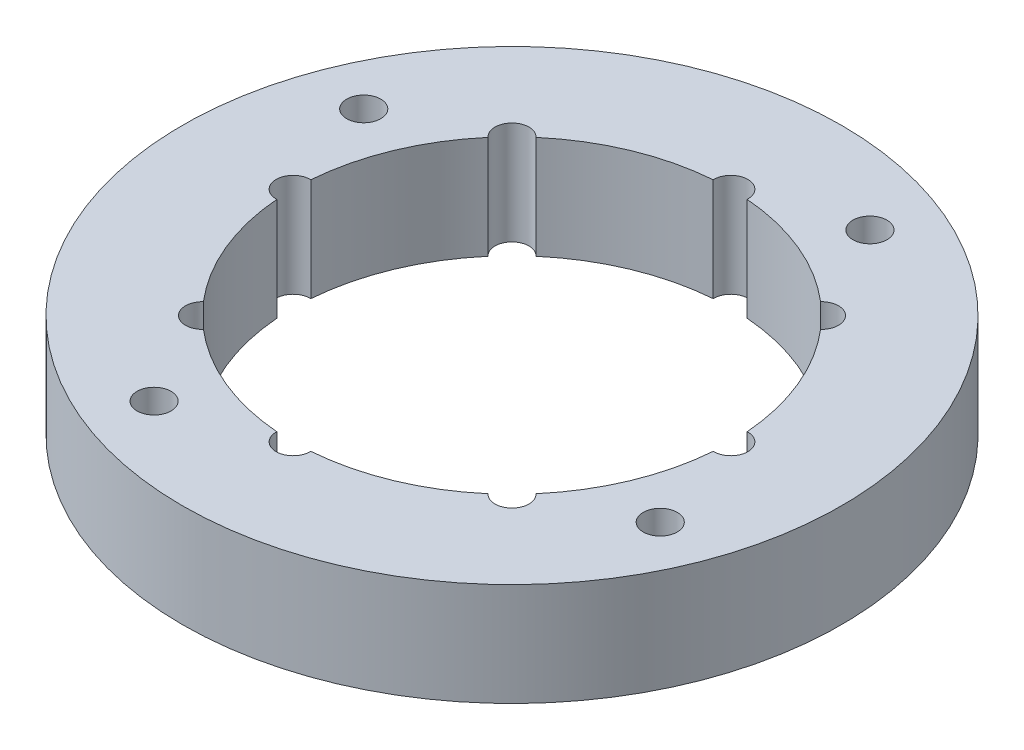
ISO-10303-21;
HEADER;
FILE_DESCRIPTION(('STEP AP214'),'2;1');
FILE_NAME('part.step','',(''),(''),'','','');
FILE_SCHEMA(('AUTOMOTIVE_DESIGN { 1 0 10303 214 1 1 1 1 }'));
ENDSEC;
DATA;
#1=APPLICATION_CONTEXT('core data for automotive mechanical design processes');
#2=APPLICATION_PROTOCOL_DEFINITION('international standard','automotive_design',2000,#1);
#3=PRODUCT_CONTEXT('',#1,'mechanical');
#4=PRODUCT('Part','Part','',(#3));
#5=PRODUCT_RELATED_PRODUCT_CATEGORY('part','',(#4));
#6=PRODUCT_DEFINITION_FORMATION('','',#4);
#7=PRODUCT_DEFINITION_CONTEXT('part definition',#1,'design');
#8=PRODUCT_DEFINITION('design','',#6,#7);
#9=PRODUCT_DEFINITION_SHAPE('','',#8);
#10=(LENGTH_UNIT() NAMED_UNIT(*) SI_UNIT(.MILLI.,.METRE.));
#11=(NAMED_UNIT(*) PLANE_ANGLE_UNIT() SI_UNIT($,.RADIAN.));
#12=(NAMED_UNIT(*) SI_UNIT($,.STERADIAN.) SOLID_ANGLE_UNIT());
#13=UNCERTAINTY_MEASURE_WITH_UNIT(LENGTH_MEASURE(1.E-05),#10,'distance_accuracy_value','');
#14=(GEOMETRIC_REPRESENTATION_CONTEXT(3) GLOBAL_UNCERTAINTY_ASSIGNED_CONTEXT((#13)) GLOBAL_UNIT_ASSIGNED_CONTEXT((#10,
#11,#12)) REPRESENTATION_CONTEXT('',''));
#15=CARTESIAN_POINT('',(0.,0.,0.));
#16=DIRECTION('',(0.,0.,1.));
#17=DIRECTION('',(1.,0.,0.));
#18=AXIS2_PLACEMENT_3D('',#15,#16,#17);
#19=CARTESIAN_POINT('',(-19.0830442572718,12.7,-19.0830442572718));
#20=DIRECTION('',(0.,-1.,0.));
#21=DIRECTION('',(0.,0.,-1.));
#22=AXIS2_PLACEMENT_3D('',#19,#20,#21);
#23=CYLINDRICAL_SURFACE('',#22,2.09550000000003);
#24=CARTESIAN_POINT('',(-19.0830442572718,0.,-19.0830442572718));
#25=DIRECTION('',(0.,1.,0.));
#26=DIRECTION('',(0.,0.,1.));
#27=AXIS2_PLACEMENT_3D('',#24,#25,#26);
#28=CIRCLE('',#27,2.09550000000003);
#29=CARTESIAN_POINT('',(-20.5061429417451,0.,-17.5448926443771));
#30=VERTEX_POINT('',#29);
#31=CARTESIAN_POINT('',(-17.5448926443771,0.,-20.5061429417451));
#32=VERTEX_POINT('',#31);
#33=EDGE_CURVE('E203',#30,#32,#28,.F.);
#34=ORIENTED_EDGE('',*,*,#33,.T.);
#35=DIRECTION('',(0.,-1.,0.));
#36=VECTOR('',#35,1.);
#37=CARTESIAN_POINT('',(-17.5448926443771,12.7,-20.5061429417451));
#38=LINE('',#37,#36);
#39=CARTESIAN_POINT('',(-17.5448926443771,12.7,-20.5061429417451));
#40=VERTEX_POINT('',#39);
#41=EDGE_CURVE('E11',#40,#32,#38,.T.);
#42=ORIENTED_EDGE('',*,*,#41,.F.);
#43=CARTESIAN_POINT('',(-19.0830442572718,12.7,-19.0830442572718));
#44=DIRECTION('',(0.,1.,0.));
#45=DIRECTION('',(0.,0.,1.));
#46=AXIS2_PLACEMENT_3D('',#43,#44,#45);
#47=CIRCLE('',#46,2.09550000000003);
#48=CARTESIAN_POINT('',(-20.5061429417451,12.7,-17.5448926443771));
#49=VERTEX_POINT('',#48);
#50=EDGE_CURVE('E318',#49,#40,#47,.F.);
#51=ORIENTED_EDGE('',*,*,#50,.F.);
#52=DIRECTION('',(0.,-1.,0.));
#53=VECTOR('',#52,1.);
#54=CARTESIAN_POINT('',(-20.5061429417451,12.7,-17.5448926443771));
#55=LINE('',#54,#53);
#56=EDGE_CURVE('E185',#49,#30,#55,.T.);
#57=ORIENTED_EDGE('',*,*,#56,.T.);
#58=EDGE_LOOP('',(#34,#42,#51,#57));
#59=FACE_BOUND('',#58,.T.);
#60=ADVANCED_FACE('F41',(#59),#23,.F.);
#61=CARTESIAN_POINT('',(0.,12.7,0.));
#62=DIRECTION('',(0.,-1.,0.));
#63=DIRECTION('',(0.,0.,-1.));
#64=AXIS2_PLACEMENT_3D('',#61,#62,#63);
#65=CYLINDRICAL_SURFACE('',#64,26.9875);
#66=CARTESIAN_POINT('',(0.,0.,0.));
#67=DIRECTION('',(0.,1.,0.));
#68=DIRECTION('',(0.,0.,1.));
#69=AXIS2_PLACEMENT_3D('',#66,#67,#68);
#70=CIRCLE('',#69,26.9875);
#71=CARTESIAN_POINT('',(-2.09392016605936,0.,-26.9061452941177));
#72=VERTEX_POINT('',#71);
#73=EDGE_CURVE('E204',#32,#72,#70,.F.);
#74=ORIENTED_EDGE('',*,*,#73,.T.);
#75=DIRECTION('',(0.,-1.,0.));
#76=VECTOR('',#75,1.);
#77=CARTESIAN_POINT('',(-2.09392016605936,12.7,-26.9061452941177));
#78=LINE('',#77,#76);
#79=CARTESIAN_POINT('',(-2.09392016605936,12.7,-26.9061452941177));
#80=VERTEX_POINT('',#79);
#81=EDGE_CURVE('E49',#80,#72,#78,.T.);
#82=ORIENTED_EDGE('',*,*,#81,.F.);
#83=CARTESIAN_POINT('',(0.,12.7,0.));
#84=DIRECTION('',(0.,1.,0.));
#85=DIRECTION('',(0.,0.,1.));
#86=AXIS2_PLACEMENT_3D('',#83,#84,#85);
#87=CIRCLE('',#86,26.9875);
#88=EDGE_CURVE('E121',#40,#80,#87,.F.);
#89=ORIENTED_EDGE('',*,*,#88,.F.);
#90=ORIENTED_EDGE('',*,*,#41,.T.);
#91=EDGE_LOOP('',(#74,#82,#89,#90));
#92=FACE_BOUND('',#91,.T.);
#93=ADVANCED_FACE('F334',(#92),#65,.F.);
#94=CARTESIAN_POINT('',(1.11022302462516E-13,12.7,-26.9874999999999));
#95=DIRECTION('',(0.,-1.,0.));
#96=DIRECTION('',(0.,0.,-1.));
#97=AXIS2_PLACEMENT_3D('',#94,#95,#96);
#98=CYLINDRICAL_SURFACE('',#97,2.09549999999993);
#99=CARTESIAN_POINT('',(1.11022302462516E-13,0.,-26.9874999999999));
#100=DIRECTION('',(0.,1.,0.));
#101=DIRECTION('',(0.,0.,1.));
#102=AXIS2_PLACEMENT_3D('',#99,#100,#101);
#103=CIRCLE('',#102,2.09549999999993);
#104=CARTESIAN_POINT('',(2.09392016605958,0.,-26.9061452941177));
#105=VERTEX_POINT('',#104);
#106=EDGE_CURVE('E206',#72,#105,#103,.F.);
#107=ORIENTED_EDGE('',*,*,#106,.T.);
#108=DIRECTION('',(0.,-1.,0.));
#109=VECTOR('',#108,1.);
#110=CARTESIAN_POINT('',(2.09392016605958,12.7,-26.9061452941177));
#111=LINE('',#110,#109);
#112=CARTESIAN_POINT('',(2.09392016605958,12.7,-26.9061452941177));
#113=VERTEX_POINT('',#112);
#114=EDGE_CURVE('E265',#113,#105,#111,.T.);
#115=ORIENTED_EDGE('',*,*,#114,.F.);
#116=CARTESIAN_POINT('',(1.11022302462516E-13,12.7,-26.9874999999999));
#117=DIRECTION('',(0.,1.,0.));
#118=DIRECTION('',(0.,0.,1.));
#119=AXIS2_PLACEMENT_3D('',#116,#117,#118);
#120=CIRCLE('',#119,2.09549999999993);
#121=EDGE_CURVE('E269',#80,#113,#120,.F.);
#122=ORIENTED_EDGE('',*,*,#121,.F.);
#123=ORIENTED_EDGE('',*,*,#81,.T.);
#124=EDGE_LOOP('',(#107,#115,#122,#123));
#125=FACE_BOUND('',#124,.T.);
#126=ADVANCED_FACE('F268',(#125),#98,.F.);
#127=CARTESIAN_POINT('',(0.,12.7,0.));
#128=DIRECTION('',(0.,-1.,0.));
#129=DIRECTION('',(0.,0.,-1.));
#130=AXIS2_PLACEMENT_3D('',#127,#128,#129);
#131=CYLINDRICAL_SURFACE('',#130,26.9875);
#132=CARTESIAN_POINT('',(0.,0.,0.));
#133=DIRECTION('',(0.,1.,0.));
#134=DIRECTION('',(0.,0.,1.));
#135=AXIS2_PLACEMENT_3D('',#132,#133,#134);
#136=CIRCLE('',#135,26.9875);
#137=CARTESIAN_POINT('',(17.5448926443797,0.,-20.5061429417429));
#138=VERTEX_POINT('',#137);
#139=EDGE_CURVE('E208',#105,#138,#136,.F.);
#140=ORIENTED_EDGE('',*,*,#139,.T.);
#141=DIRECTION('',(0.,-1.,0.));
#142=VECTOR('',#141,1.);
#143=CARTESIAN_POINT('',(17.5448926443797,12.7,-20.5061429417429));
#144=LINE('',#143,#142);
#145=CARTESIAN_POINT('',(17.5448926443797,12.7,-20.5061429417429));
#146=VERTEX_POINT('',#145);
#147=EDGE_CURVE('E259',#146,#138,#144,.T.);
#148=ORIENTED_EDGE('',*,*,#147,.F.);
#149=CARTESIAN_POINT('',(0.,12.7,0.));
#150=DIRECTION('',(0.,1.,0.));
#151=DIRECTION('',(0.,0.,1.));
#152=AXIS2_PLACEMENT_3D('',#149,#150,#151);
#153=CIRCLE('',#152,26.9875);
#154=EDGE_CURVE('E288',#113,#146,#153,.F.);
#155=ORIENTED_EDGE('',*,*,#154,.F.);
#156=ORIENTED_EDGE('',*,*,#114,.T.);
#157=EDGE_LOOP('',(#140,#148,#155,#156));
#158=FACE_BOUND('',#157,.T.);
#159=ADVANCED_FACE('F276',(#158),#131,.F.);
#160=CARTESIAN_POINT('',(19.0830442572715,12.7,-19.0830442572726));
#161=DIRECTION('',(0.,-1.,0.));
#162=DIRECTION('',(0.,0.,-1.));
#163=AXIS2_PLACEMENT_3D('',#160,#161,#162);
#164=CYLINDRICAL_SURFACE('',#163,2.09549999999588);
#165=CARTESIAN_POINT('',(19.0830442572715,0.,-19.0830442572726));
#166=DIRECTION('',(0.,1.,0.));
#167=DIRECTION('',(0.,0.,1.));
#168=AXIS2_PLACEMENT_3D('',#165,#166,#167);
#169=CIRCLE('',#168,2.09549999999588);
#170=CARTESIAN_POINT('',(20.5061429417419,0.,-17.5448926443808));
#171=VERTEX_POINT('',#170);
#172=EDGE_CURVE('E209',#138,#171,#169,.F.);
#173=ORIENTED_EDGE('',*,*,#172,.T.);
#174=DIRECTION('',(0.,-1.,0.));
#175=VECTOR('',#174,1.);
#176=CARTESIAN_POINT('',(20.5061429417419,12.7,-17.5448926443808));
#177=LINE('',#176,#175);
#178=CARTESIAN_POINT('',(20.5061429417419,12.7,-17.5448926443808));
#179=VERTEX_POINT('',#178);
#180=EDGE_CURVE('E258',#179,#171,#177,.T.);
#181=ORIENTED_EDGE('',*,*,#180,.F.);
#182=CARTESIAN_POINT('',(19.0830442572715,12.7,-19.0830442572726));
#183=DIRECTION('',(0.,1.,0.));
#184=DIRECTION('',(0.,0.,1.));
#185=AXIS2_PLACEMENT_3D('',#182,#183,#184);
#186=CIRCLE('',#185,2.09549999999588);
#187=EDGE_CURVE('E282',#146,#179,#186,.F.);
#188=ORIENTED_EDGE('',*,*,#187,.F.);
#189=ORIENTED_EDGE('',*,*,#147,.T.);
#190=EDGE_LOOP('',(#173,#181,#188,#189));
#191=FACE_BOUND('',#190,.T.);
#192=ADVANCED_FACE('F285',(#191),#164,.F.);
#193=CARTESIAN_POINT('',(0.,12.7,0.));
#194=DIRECTION('',(0.,-1.,0.));
#195=DIRECTION('',(0.,0.,-1.));
#196=AXIS2_PLACEMENT_3D('',#193,#194,#195);
#197=CYLINDRICAL_SURFACE('',#196,26.9875);
#198=CARTESIAN_POINT('',(0.,0.,0.));
#199=DIRECTION('',(0.,1.,0.));
#200=DIRECTION('',(0.,0.,1.));
#201=AXIS2_PLACEMENT_3D('',#198,#199,#200);
#202=CIRCLE('',#201,26.9875);
#203=CARTESIAN_POINT('',(26.9061452941176,0.,-2.09392016605953));
#204=VERTEX_POINT('',#203);
#205=EDGE_CURVE('E215',#171,#204,#202,.F.);
#206=ORIENTED_EDGE('',*,*,#205,.T.);
#207=DIRECTION('',(0.,-1.,0.));
#208=VECTOR('',#207,1.);
#209=CARTESIAN_POINT('',(26.9061452941176,12.7,-2.09392016605953));
#210=LINE('',#209,#208);
#211=CARTESIAN_POINT('',(26.9061452941176,12.7,-2.09392016605953));
#212=VERTEX_POINT('',#211);
#213=EDGE_CURVE('E251',#212,#204,#210,.T.);
#214=ORIENTED_EDGE('',*,*,#213,.F.);
#215=CARTESIAN_POINT('',(0.,12.7,0.));
#216=DIRECTION('',(0.,1.,0.));
#217=DIRECTION('',(0.,0.,1.));
#218=AXIS2_PLACEMENT_3D('',#215,#216,#217);
#219=CIRCLE('',#218,26.9875);
#220=EDGE_CURVE('E290',#179,#212,#219,.F.);
#221=ORIENTED_EDGE('',*,*,#220,.F.);
#222=ORIENTED_EDGE('',*,*,#180,.T.);
#223=EDGE_LOOP('',(#206,#214,#221,#222));
#224=FACE_BOUND('',#223,.T.);
#225=ADVANCED_FACE('F495',(#224),#197,.F.);
#226=CARTESIAN_POINT('',(26.9875000000012,12.7,-4.30211422042248E-13));
#227=DIRECTION('',(0.,-1.,0.));
#228=DIRECTION('',(0.,0.,-1.));
#229=AXIS2_PLACEMENT_3D('',#226,#227,#228);
#230=CYLINDRICAL_SURFACE('',#229,2.09549999999961);
#231=CARTESIAN_POINT('',(26.9875000000012,0.,-4.30211422042248E-13));
#232=DIRECTION('',(0.,1.,0.));
#233=DIRECTION('',(0.,0.,1.));
#234=AXIS2_PLACEMENT_3D('',#231,#232,#233);
#235=CIRCLE('',#234,2.09549999999961);
#236=CARTESIAN_POINT('',(26.9061452941177,0.,2.09392016605867));
#237=VERTEX_POINT('',#236);
#238=EDGE_CURVE('E212',#204,#237,#235,.F.);
#239=ORIENTED_EDGE('',*,*,#238,.T.);
#240=DIRECTION('',(0.,-1.,0.));
#241=VECTOR('',#240,1.);
#242=CARTESIAN_POINT('',(26.9061452941177,12.7,2.09392016605867));
#243=LINE('',#242,#241);
#244=CARTESIAN_POINT('',(26.9061452941177,12.7,2.09392016605867));
#245=VERTEX_POINT('',#244);
#246=EDGE_CURVE('E246',#245,#237,#243,.T.);
#247=ORIENTED_EDGE('',*,*,#246,.F.);
#248=CARTESIAN_POINT('',(26.9875000000012,12.7,-4.30211422042248E-13));
#249=DIRECTION('',(0.,1.,0.));
#250=DIRECTION('',(0.,0.,1.));
#251=AXIS2_PLACEMENT_3D('',#248,#249,#250);
#252=CIRCLE('',#251,2.09549999999961);
#253=EDGE_CURVE('E286',#212,#245,#252,.F.);
#254=ORIENTED_EDGE('',*,*,#253,.F.);
#255=ORIENTED_EDGE('',*,*,#213,.T.);
#256=EDGE_LOOP('',(#239,#247,#254,#255));
#257=FACE_BOUND('',#256,.T.);
#258=ADVANCED_FACE('F483',(#257),#230,.F.);
#259=CARTESIAN_POINT('',(0.,12.7,0.));
#260=DIRECTION('',(0.,-1.,0.));
#261=DIRECTION('',(0.,0.,-1.));
#262=AXIS2_PLACEMENT_3D('',#259,#260,#261);
#263=CYLINDRICAL_SURFACE('',#262,26.9875);
#264=CARTESIAN_POINT('',(0.,0.,0.));
#265=DIRECTION('',(0.,1.,0.));
#266=DIRECTION('',(0.,0.,1.));
#267=AXIS2_PLACEMENT_3D('',#264,#265,#266);
#268=CIRCLE('',#267,26.9875);
#269=CARTESIAN_POINT('',(20.5061429417444,0.,17.5448926443779));
#270=VERTEX_POINT('',#269);
#271=EDGE_CURVE('E216',#237,#270,#268,.F.);
#272=ORIENTED_EDGE('',*,*,#271,.T.);
#273=DIRECTION('',(0.,-1.,0.));
#274=VECTOR('',#273,1.);
#275=CARTESIAN_POINT('',(20.5061429417444,12.7,17.5448926443779));
#276=LINE('',#275,#274);
#277=CARTESIAN_POINT('',(20.5061429417444,12.7,17.5448926443779));
#278=VERTEX_POINT('',#277);
#279=EDGE_CURVE('E250',#278,#270,#276,.T.);
#280=ORIENTED_EDGE('',*,*,#279,.F.);
#281=CARTESIAN_POINT('',(0.,12.7,0.));
#282=DIRECTION('',(0.,1.,0.));
#283=DIRECTION('',(0.,0.,1.));
#284=AXIS2_PLACEMENT_3D('',#281,#282,#283);
#285=CIRCLE('',#284,26.9875);
#286=EDGE_CURVE('E299',#245,#278,#285,.F.);
#287=ORIENTED_EDGE('',*,*,#286,.F.);
#288=ORIENTED_EDGE('',*,*,#246,.T.);
#289=EDGE_LOOP('',(#272,#280,#287,#288));
#290=FACE_BOUND('',#289,.T.);
#291=ADVANCED_FACE('F475',(#290),#263,.F.);
#292=CARTESIAN_POINT('',(19.0830442572704,12.7,19.0830442572693));
#293=DIRECTION('',(0.,-1.,0.));
#294=DIRECTION('',(0.,0.,-1.));
#295=AXIS2_PLACEMENT_3D('',#292,#293,#294);
#296=CYLINDRICAL_SURFACE('',#295,2.09549999999814);
#297=CARTESIAN_POINT('',(19.0830442572704,0.,19.0830442572693));
#298=DIRECTION('',(0.,1.,0.));
#299=DIRECTION('',(0.,0.,1.));
#300=AXIS2_PLACEMENT_3D('',#297,#298,#299);
#301=CIRCLE('',#300,2.09549999999814);
#302=CARTESIAN_POINT('',(17.5448926443791,0.,20.5061429417434));
#303=VERTEX_POINT('',#302);
#304=EDGE_CURVE('E217',#270,#303,#301,.F.);
#305=ORIENTED_EDGE('',*,*,#304,.T.);
#306=DIRECTION('',(0.,-1.,0.));
#307=VECTOR('',#306,1.);
#308=CARTESIAN_POINT('',(17.5448926443791,12.7,20.5061429417434));
#309=LINE('',#308,#307);
#310=CARTESIAN_POINT('',(17.5448926443791,12.7,20.5061429417434));
#311=VERTEX_POINT('',#310);
#312=EDGE_CURVE('E243',#311,#303,#309,.T.);
#313=ORIENTED_EDGE('',*,*,#312,.F.);
#314=CARTESIAN_POINT('',(19.0830442572704,12.7,19.0830442572693));
#315=DIRECTION('',(0.,1.,0.));
#316=DIRECTION('',(0.,0.,1.));
#317=AXIS2_PLACEMENT_3D('',#314,#315,#316);
#318=CIRCLE('',#317,2.09549999999814);
#319=EDGE_CURVE('E300',#278,#311,#318,.F.);
#320=ORIENTED_EDGE('',*,*,#319,.F.);
#321=ORIENTED_EDGE('',*,*,#279,.T.);
#322=EDGE_LOOP('',(#305,#313,#320,#321));
#323=FACE_BOUND('',#322,.T.);
#324=ADVANCED_FACE('F462',(#323),#296,.F.);
#325=CARTESIAN_POINT('',(0.,12.7,0.));
#326=DIRECTION('',(0.,-1.,0.));
#327=DIRECTION('',(0.,0.,-1.));
#328=AXIS2_PLACEMENT_3D('',#325,#326,#327);
#329=CYLINDRICAL_SURFACE('',#328,26.9875);
#330=CARTESIAN_POINT('',(0.,0.,0.));
#331=DIRECTION('',(0.,1.,0.));
#332=DIRECTION('',(0.,0.,1.));
#333=AXIS2_PLACEMENT_3D('',#330,#331,#332);
#334=CIRCLE('',#333,26.9875);
#335=CARTESIAN_POINT('',(2.09392016605725,0.,26.9061452941178));
#336=VERTEX_POINT('',#335);
#337=EDGE_CURVE('E219',#303,#336,#334,.F.);
#338=ORIENTED_EDGE('',*,*,#337,.T.);
#339=DIRECTION('',(0.,-1.,0.));
#340=VECTOR('',#339,1.);
#341=CARTESIAN_POINT('',(2.09392016605725,12.7,26.9061452941178));
#342=LINE('',#341,#340);
#343=CARTESIAN_POINT('',(2.09392016605725,12.7,26.9061452941178));
#344=VERTEX_POINT('',#343);
#345=EDGE_CURVE('E244',#344,#336,#342,.T.);
#346=ORIENTED_EDGE('',*,*,#345,.F.);
#347=CARTESIAN_POINT('',(0.,12.7,0.));
#348=DIRECTION('',(0.,1.,0.));
#349=DIRECTION('',(0.,0.,1.));
#350=AXIS2_PLACEMENT_3D('',#347,#348,#349);
#351=CIRCLE('',#350,26.9875);
#352=EDGE_CURVE('E297',#311,#344,#351,.F.);
#353=ORIENTED_EDGE('',*,*,#352,.F.);
#354=ORIENTED_EDGE('',*,*,#312,.T.);
#355=EDGE_LOOP('',(#338,#346,#353,#354));
#356=FACE_BOUND('',#355,.T.);
#357=ADVANCED_FACE('F457',(#356),#329,.F.);
#358=CARTESIAN_POINT('',(0.,12.7,26.9875000000033));
#359=DIRECTION('',(0.,-1.,0.));
#360=DIRECTION('',(0.,0.,-1.));
#361=AXIS2_PLACEMENT_3D('',#358,#359,#360);
#362=CYLINDRICAL_SURFACE('',#361,2.09549999999783);
#363=CARTESIAN_POINT('',(0.,0.,26.9875000000033));
#364=DIRECTION('',(0.,1.,0.));
#365=DIRECTION('',(0.,0.,1.));
#366=AXIS2_PLACEMENT_3D('',#363,#364,#365);
#367=CIRCLE('',#366,2.09549999999783);
#368=CARTESIAN_POINT('',(-2.09392016605724,0.,26.9061452941178));
#369=VERTEX_POINT('',#368);
#370=EDGE_CURVE('E225',#336,#369,#367,.F.);
#371=ORIENTED_EDGE('',*,*,#370,.T.);
#372=DIRECTION('',(0.,-1.,0.));
#373=VECTOR('',#372,1.);
#374=CARTESIAN_POINT('',(-2.09392016605724,12.7,26.9061452941178));
#375=LINE('',#374,#373);
#376=CARTESIAN_POINT('',(-2.09392016605724,12.7,26.9061452941178));
#377=VERTEX_POINT('',#376);
#378=EDGE_CURVE('E236',#377,#369,#375,.T.);
#379=ORIENTED_EDGE('',*,*,#378,.F.);
#380=CARTESIAN_POINT('',(0.,12.7,26.9875000000033));
#381=DIRECTION('',(0.,1.,0.));
#382=DIRECTION('',(0.,0.,1.));
#383=AXIS2_PLACEMENT_3D('',#380,#381,#382);
#384=CIRCLE('',#383,2.09549999999783);
#385=EDGE_CURVE('E305',#344,#377,#384,.F.);
#386=ORIENTED_EDGE('',*,*,#385,.F.);
#387=ORIENTED_EDGE('',*,*,#345,.T.);
#388=EDGE_LOOP('',(#371,#379,#386,#387));
#389=FACE_BOUND('',#388,.T.);
#390=ADVANCED_FACE('F450',(#389),#362,.F.);
#391=CARTESIAN_POINT('',(0.,12.7,0.));
#392=DIRECTION('',(0.,-1.,0.));
#393=DIRECTION('',(0.,0.,-1.));
#394=AXIS2_PLACEMENT_3D('',#391,#392,#393);
#395=CYLINDRICAL_SURFACE('',#394,26.9875);
#396=CARTESIAN_POINT('',(0.,0.,0.));
#397=DIRECTION('',(0.,1.,0.));
#398=DIRECTION('',(0.,0.,1.));
#399=AXIS2_PLACEMENT_3D('',#396,#397,#398);
#400=CIRCLE('',#399,26.9875);
#401=CARTESIAN_POINT('',(-17.5448926443771,0.,20.506142941745));
#402=VERTEX_POINT('',#401);
#403=EDGE_CURVE('E221',#369,#402,#400,.F.);
#404=ORIENTED_EDGE('',*,*,#403,.T.);
#405=DIRECTION('',(0.,-1.,0.));
#406=VECTOR('',#405,1.);
#407=CARTESIAN_POINT('',(-17.5448926443771,12.7,20.506142941745));
#408=LINE('',#407,#406);
#409=CARTESIAN_POINT('',(-17.5448926443771,12.7,20.506142941745));
#410=VERTEX_POINT('',#409);
#411=EDGE_CURVE('E231',#410,#402,#408,.T.);
#412=ORIENTED_EDGE('',*,*,#411,.F.);
#413=CARTESIAN_POINT('',(0.,12.7,0.));
#414=DIRECTION('',(0.,1.,0.));
#415=DIRECTION('',(0.,0.,1.));
#416=AXIS2_PLACEMENT_3D('',#413,#414,#415);
#417=CIRCLE('',#416,26.9875);
#418=EDGE_CURVE('E304',#377,#410,#417,.F.);
#419=ORIENTED_EDGE('',*,*,#418,.F.);
#420=ORIENTED_EDGE('',*,*,#378,.T.);
#421=EDGE_LOOP('',(#404,#412,#419,#420));
#422=FACE_BOUND('',#421,.T.);
#423=ADVANCED_FACE('F309',(#422),#395,.F.);
#424=CARTESIAN_POINT('',(-19.0830442572707,12.7,19.0830442572718));
#425=DIRECTION('',(0.,-1.,0.));
#426=DIRECTION('',(0.,0.,-1.));
#427=AXIS2_PLACEMENT_3D('',#424,#425,#426);
#428=CYLINDRICAL_SURFACE('',#427,2.09549999999915);
#429=CARTESIAN_POINT('',(-19.0830442572707,0.,19.0830442572718));
#430=DIRECTION('',(0.,1.,0.));
#431=DIRECTION('',(0.,0.,1.));
#432=AXIS2_PLACEMENT_3D('',#429,#430,#431);
#433=CIRCLE('',#432,2.09549999999915);
#434=CARTESIAN_POINT('',(-20.506142941744,0.,17.5448926443783));
#435=VERTEX_POINT('',#434);
#436=EDGE_CURVE('E229',#402,#435,#433,.F.);
#437=ORIENTED_EDGE('',*,*,#436,.T.);
#438=DIRECTION('',(0.,-1.,0.));
#439=VECTOR('',#438,1.);
#440=CARTESIAN_POINT('',(-20.506142941744,12.7,17.5448926443783));
#441=LINE('',#440,#439);
#442=CARTESIAN_POINT('',(-20.506142941744,12.7,17.5448926443783));
#443=VERTEX_POINT('',#442);
#444=EDGE_CURVE('E180',#443,#435,#441,.T.);
#445=ORIENTED_EDGE('',*,*,#444,.F.);
#446=CARTESIAN_POINT('',(-19.0830442572707,12.7,19.0830442572718));
#447=DIRECTION('',(0.,1.,0.));
#448=DIRECTION('',(0.,0.,1.));
#449=AXIS2_PLACEMENT_3D('',#446,#447,#448);
#450=CIRCLE('',#449,2.09549999999915);
#451=EDGE_CURVE('E169',#410,#443,#450,.F.);
#452=ORIENTED_EDGE('',*,*,#451,.F.);
#453=ORIENTED_EDGE('',*,*,#411,.T.);
#454=EDGE_LOOP('',(#437,#445,#452,#453));
#455=FACE_BOUND('',#454,.T.);
#456=ADVANCED_FACE('F314',(#455),#428,.F.);
#457=CARTESIAN_POINT('',(0.,12.7,0.));
#458=DIRECTION('',(0.,-1.,0.));
#459=DIRECTION('',(0.,0.,-1.));
#460=AXIS2_PLACEMENT_3D('',#457,#458,#459);
#461=CYLINDRICAL_SURFACE('',#460,26.9875);
#462=CARTESIAN_POINT('',(0.,0.,0.));
#463=DIRECTION('',(0.,1.,0.));
#464=DIRECTION('',(0.,0.,1.));
#465=AXIS2_PLACEMENT_3D('',#462,#463,#464);
#466=CIRCLE('',#465,26.9875);
#467=CARTESIAN_POINT('',(-26.9061452941176,0.,2.09392016605954));
#468=VERTEX_POINT('',#467);
#469=EDGE_CURVE('E177',#435,#468,#466,.F.);
#470=ORIENTED_EDGE('',*,*,#469,.T.);
#471=DIRECTION('',(0.,-1.,0.));
#472=VECTOR('',#471,1.);
#473=CARTESIAN_POINT('',(-26.9061452941176,12.7,2.09392016605954));
#474=LINE('',#473,#472);
#475=CARTESIAN_POINT('',(-26.9061452941176,12.7,2.09392016605954));
#476=VERTEX_POINT('',#475);
#477=EDGE_CURVE('E175',#476,#468,#474,.T.);
#478=ORIENTED_EDGE('',*,*,#477,.F.);
#479=CARTESIAN_POINT('',(0.,12.7,0.));
#480=DIRECTION('',(0.,1.,0.));
#481=DIRECTION('',(0.,0.,1.));
#482=AXIS2_PLACEMENT_3D('',#479,#480,#481);
#483=CIRCLE('',#482,26.9875);
#484=EDGE_CURVE('E165',#443,#476,#483,.F.);
#485=ORIENTED_EDGE('',*,*,#484,.F.);
#486=ORIENTED_EDGE('',*,*,#444,.T.);
#487=EDGE_LOOP('',(#470,#478,#485,#486));
#488=FACE_BOUND('',#487,.T.);
#489=ADVANCED_FACE('F173',(#488),#461,.F.);
#490=CARTESIAN_POINT('',(-26.9875000000001,12.7,3.95516952522712E-13));
#491=DIRECTION('',(0.,-1.,0.));
#492=DIRECTION('',(0.,0.,-1.));
#493=AXIS2_PLACEMENT_3D('',#490,#491,#492);
#494=CYLINDRICAL_SURFACE('',#493,2.0954999999996);
#495=CARTESIAN_POINT('',(-26.9875000000001,0.,3.95516952522712E-13));
#496=DIRECTION('',(0.,1.,0.));
#497=DIRECTION('',(0.,0.,1.));
#498=AXIS2_PLACEMENT_3D('',#495,#496,#497);
#499=CIRCLE('',#498,2.0954999999996);
#500=CARTESIAN_POINT('',(-26.9061452941177,0.,-2.09392016605874));
#501=VERTEX_POINT('',#500);
#502=EDGE_CURVE('E112',#468,#501,#499,.F.);
#503=ORIENTED_EDGE('',*,*,#502,.T.);
#504=DIRECTION('',(0.,-1.,0.));
#505=VECTOR('',#504,1.);
#506=CARTESIAN_POINT('',(-26.9061452941177,12.7,-2.09392016605874));
#507=LINE('',#506,#505);
#508=CARTESIAN_POINT('',(-26.9061452941177,12.7,-2.09392016605874));
#509=VERTEX_POINT('',#508);
#510=EDGE_CURVE('E178',#509,#501,#507,.T.);
#511=ORIENTED_EDGE('',*,*,#510,.F.);
#512=CARTESIAN_POINT('',(-26.9875000000001,12.7,3.95516952522712E-13));
#513=DIRECTION('',(0.,1.,0.));
#514=DIRECTION('',(0.,0.,1.));
#515=AXIS2_PLACEMENT_3D('',#512,#513,#514);
#516=CIRCLE('',#515,2.0954999999996);
#517=EDGE_CURVE('E167',#476,#509,#516,.F.);
#518=ORIENTED_EDGE('',*,*,#517,.F.);
#519=ORIENTED_EDGE('',*,*,#477,.T.);
#520=EDGE_LOOP('',(#503,#511,#518,#519));
#521=FACE_BOUND('',#520,.T.);
#522=ADVANCED_FACE('F176',(#521),#494,.F.);
#523=CARTESIAN_POINT('',(0.,12.7,0.));
#524=DIRECTION('',(0.,-1.,0.));
#525=DIRECTION('',(0.,0.,-1.));
#526=AXIS2_PLACEMENT_3D('',#523,#524,#525);
#527=CYLINDRICAL_SURFACE('',#526,40.64);
#528=CARTESIAN_POINT('',(0.,12.7,0.));
#529=DIRECTION('',(0.,1.,0.));
#530=DIRECTION('',(0.,0.,1.));
#531=AXIS2_PLACEMENT_3D('',#528,#529,#530);
#532=CIRCLE('',#531,40.64);
#533=CARTESIAN_POINT('',(0.,12.7,40.64));
#534=VERTEX_POINT('',#533);
#535=EDGE_CURVE('E617',#534,#534,#532,.T.);
#536=ORIENTED_EDGE('',*,*,#535,.F.);
#537=EDGE_LOOP('',(#536));
#538=FACE_BOUND('',#537,.T.);
#539=CARTESIAN_POINT('',(0.,0.,0.));
#540=DIRECTION('',(0.,1.,0.));
#541=DIRECTION('',(0.,0.,1.));
#542=AXIS2_PLACEMENT_3D('',#539,#540,#541);
#543=CIRCLE('',#542,40.64);
#544=CARTESIAN_POINT('',(0.,0.,40.64));
#545=VERTEX_POINT('',#544);
#546=EDGE_CURVE('E196',#545,#545,#543,.T.);
#547=ORIENTED_EDGE('',*,*,#546,.T.);
#548=EDGE_LOOP('',(#547));
#549=FACE_BOUND('',#548,.T.);
#550=ADVANCED_FACE('F342',(#538,#549),#527,.T.);
#551=CARTESIAN_POINT('',(-12.9278117121578,12.7,31.2104983672961));
#552=DIRECTION('',(0.,-1.,0.));
#553=DIRECTION('',(0.,0.,-1.));
#554=AXIS2_PLACEMENT_3D('',#551,#552,#553);
#555=CYLINDRICAL_SURFACE('',#554,2.10000000000037);
#556=CARTESIAN_POINT('',(-12.9278117121578,12.7,31.2104983672961));
#557=DIRECTION('',(0.,1.,0.));
#558=DIRECTION('',(0.,0.,1.));
#559=AXIS2_PLACEMENT_3D('',#556,#557,#558);
#560=CIRCLE('',#559,2.10000000000037);
#561=CARTESIAN_POINT('',(-12.9278117121578,12.7,33.3104983672965));
#562=VERTEX_POINT('',#561);
#563=EDGE_CURVE('E606',#562,#562,#560,.T.);
#564=ORIENTED_EDGE('',*,*,#563,.T.);
#565=EDGE_LOOP('',(#564));
#566=FACE_BOUND('',#565,.T.);
#567=CARTESIAN_POINT('',(-12.9278117121578,0.,31.2104983672961));
#568=DIRECTION('',(0.,1.,0.));
#569=DIRECTION('',(0.,0.,1.));
#570=AXIS2_PLACEMENT_3D('',#567,#568,#569);
#571=CIRCLE('',#570,2.10000000000037);
#572=CARTESIAN_POINT('',(-12.9278117121578,0.,33.3104983672965));
#573=VERTEX_POINT('',#572);
#574=EDGE_CURVE('E191',#573,#573,#571,.T.);
#575=ORIENTED_EDGE('',*,*,#574,.F.);
#576=EDGE_LOOP('',(#575));
#577=FACE_BOUND('',#576,.T.);
#578=ADVANCED_FACE('F344',(#566,#577),#555,.F.);
#579=CARTESIAN_POINT('',(-31.2104983672961,12.7,-12.9278117121579));
#580=DIRECTION('',(0.,-1.,0.));
#581=DIRECTION('',(0.,0.,-1.));
#582=AXIS2_PLACEMENT_3D('',#579,#580,#581);
#583=CYLINDRICAL_SURFACE('',#582,2.0999999999997);
#584=CARTESIAN_POINT('',(-31.2104983672961,12.7,-12.9278117121579));
#585=DIRECTION('',(0.,1.,0.));
#586=DIRECTION('',(0.,0.,1.));
#587=AXIS2_PLACEMENT_3D('',#584,#585,#586);
#588=CIRCLE('',#587,2.0999999999997);
#589=CARTESIAN_POINT('',(-31.2104983672961,12.7,-10.8278117121582));
#590=VERTEX_POINT('',#589);
#591=EDGE_CURVE('E607',#590,#590,#588,.T.);
#592=ORIENTED_EDGE('',*,*,#591,.T.);
#593=EDGE_LOOP('',(#592));
#594=FACE_BOUND('',#593,.T.);
#595=CARTESIAN_POINT('',(-31.2104983672961,0.,-12.9278117121579));
#596=DIRECTION('',(0.,1.,0.));
#597=DIRECTION('',(0.,0.,1.));
#598=AXIS2_PLACEMENT_3D('',#595,#596,#597);
#599=CIRCLE('',#598,2.0999999999997);
#600=CARTESIAN_POINT('',(-31.2104983672961,0.,-10.8278117121582));
#601=VERTEX_POINT('',#600);
#602=EDGE_CURVE('E195',#601,#601,#599,.T.);
#603=ORIENTED_EDGE('',*,*,#602,.F.);
#604=EDGE_LOOP('',(#603));
#605=FACE_BOUND('',#604,.T.);
#606=ADVANCED_FACE('F346',(#594,#605),#583,.F.);
#607=CARTESIAN_POINT('',(31.210498367296,12.7,12.9278117121581));
#608=DIRECTION('',(0.,-1.,0.));
#609=DIRECTION('',(0.,0.,-1.));
#610=AXIS2_PLACEMENT_3D('',#607,#608,#609);
#611=CYLINDRICAL_SURFACE('',#610,2.1000000000003);
#612=CARTESIAN_POINT('',(31.210498367296,12.7,12.9278117121581));
#613=DIRECTION('',(0.,1.,0.));
#614=DIRECTION('',(0.,0.,1.));
#615=AXIS2_PLACEMENT_3D('',#612,#613,#614);
#616=CIRCLE('',#615,2.1000000000003);
#617=CARTESIAN_POINT('',(31.210498367296,12.7,15.0278117121584));
#618=VERTEX_POINT('',#617);
#619=EDGE_CURVE('E359',#618,#618,#616,.T.);
#620=ORIENTED_EDGE('',*,*,#619,.T.);
#621=EDGE_LOOP('',(#620));
#622=FACE_BOUND('',#621,.T.);
#623=CARTESIAN_POINT('',(31.210498367296,0.,12.9278117121581));
#624=DIRECTION('',(0.,1.,0.));
#625=DIRECTION('',(0.,0.,1.));
#626=AXIS2_PLACEMENT_3D('',#623,#624,#625);
#627=CIRCLE('',#626,2.1000000000003);
#628=CARTESIAN_POINT('',(31.210498367296,0.,15.0278117121584));
#629=VERTEX_POINT('',#628);
#630=EDGE_CURVE('E188',#629,#629,#627,.T.);
#631=ORIENTED_EDGE('',*,*,#630,.F.);
#632=EDGE_LOOP('',(#631));
#633=FACE_BOUND('',#632,.T.);
#634=ADVANCED_FACE('F327',(#622,#633),#611,.F.);
#635=CARTESIAN_POINT('',(12.927811712158,12.7,-31.2104983672961));
#636=DIRECTION('',(0.,-1.,0.));
#637=DIRECTION('',(0.,0.,-1.));
#638=AXIS2_PLACEMENT_3D('',#635,#636,#637);
#639=CYLINDRICAL_SURFACE('',#638,2.09999999999963);
#640=CARTESIAN_POINT('',(12.927811712158,12.7,-31.2104983672961));
#641=DIRECTION('',(0.,1.,0.));
#642=DIRECTION('',(0.,0.,1.));
#643=AXIS2_PLACEMENT_3D('',#640,#641,#642);
#644=CIRCLE('',#643,2.09999999999963);
#645=CARTESIAN_POINT('',(12.927811712158,12.7,-29.1104983672964));
#646=VERTEX_POINT('',#645);
#647=EDGE_CURVE('E232',#646,#646,#644,.T.);
#648=ORIENTED_EDGE('',*,*,#647,.T.);
#649=EDGE_LOOP('',(#648));
#650=FACE_BOUND('',#649,.T.);
#651=CARTESIAN_POINT('',(12.927811712158,0.,-31.2104983672961));
#652=DIRECTION('',(0.,1.,0.));
#653=DIRECTION('',(0.,0.,1.));
#654=AXIS2_PLACEMENT_3D('',#651,#652,#653);
#655=CIRCLE('',#654,2.09999999999963);
#656=CARTESIAN_POINT('',(12.927811712158,0.,-29.1104983672964));
#657=VERTEX_POINT('',#656);
#658=EDGE_CURVE('E189',#657,#657,#655,.T.);
#659=ORIENTED_EDGE('',*,*,#658,.F.);
#660=EDGE_LOOP('',(#659));
#661=FACE_BOUND('',#660,.T.);
#662=ADVANCED_FACE('F43',(#650,#661),#639,.F.);
#663=CARTESIAN_POINT('',(0.,12.7,0.));
#664=DIRECTION('',(0.,-1.,0.));
#665=DIRECTION('',(0.,0.,-1.));
#666=AXIS2_PLACEMENT_3D('',#663,#664,#665);
#667=CYLINDRICAL_SURFACE('',#666,26.9875);
#668=CARTESIAN_POINT('',(0.,0.,0.));
#669=DIRECTION('',(0.,1.,0.));
#670=DIRECTION('',(0.,0.,1.));
#671=AXIS2_PLACEMENT_3D('',#668,#669,#670);
#672=CIRCLE('',#671,26.9875);
#673=EDGE_CURVE('E116',#501,#30,#672,.F.);
#674=ORIENTED_EDGE('',*,*,#673,.T.);
#675=ORIENTED_EDGE('',*,*,#56,.F.);
#676=CARTESIAN_POINT('',(0.,12.7,0.));
#677=DIRECTION('',(0.,1.,0.));
#678=DIRECTION('',(0.,0.,1.));
#679=AXIS2_PLACEMENT_3D('',#676,#677,#678);
#680=CIRCLE('',#679,26.9875);
#681=EDGE_CURVE('E59',#509,#49,#680,.F.);
#682=ORIENTED_EDGE('',*,*,#681,.F.);
#683=ORIENTED_EDGE('',*,*,#510,.T.);
#684=EDGE_LOOP('',(#674,#675,#682,#683));
#685=FACE_BOUND('',#684,.T.);
#686=ADVANCED_FACE('F317',(#685),#667,.F.);
#687=CARTESIAN_POINT('',(0.,12.7,0.));
#688=DIRECTION('',(0.,1.,0.));
#689=DIRECTION('',(0.,0.,1.));
#690=AXIS2_PLACEMENT_3D('',#687,#688,#689);
#691=PLANE('',#690);
#692=ORIENTED_EDGE('',*,*,#647,.F.);
#693=EDGE_LOOP('',(#692));
#694=FACE_BOUND('',#693,.T.);
#695=ORIENTED_EDGE('',*,*,#619,.F.);
#696=EDGE_LOOP('',(#695));
#697=FACE_BOUND('',#696,.T.);
#698=ORIENTED_EDGE('',*,*,#591,.F.);
#699=EDGE_LOOP('',(#698));
#700=FACE_BOUND('',#699,.T.);
#701=ORIENTED_EDGE('',*,*,#563,.F.);
#702=EDGE_LOOP('',(#701));
#703=FACE_BOUND('',#702,.T.);
#704=ORIENTED_EDGE('',*,*,#535,.T.);
#705=EDGE_LOOP('',(#704));
#706=FACE_BOUND('',#705,.T.);
#707=ORIENTED_EDGE('',*,*,#50,.T.);
#708=ORIENTED_EDGE('',*,*,#88,.T.);
#709=ORIENTED_EDGE('',*,*,#121,.T.);
#710=ORIENTED_EDGE('',*,*,#154,.T.);
#711=ORIENTED_EDGE('',*,*,#187,.T.);
#712=ORIENTED_EDGE('',*,*,#220,.T.);
#713=ORIENTED_EDGE('',*,*,#253,.T.);
#714=ORIENTED_EDGE('',*,*,#286,.T.);
#715=ORIENTED_EDGE('',*,*,#319,.T.);
#716=ORIENTED_EDGE('',*,*,#352,.T.);
#717=ORIENTED_EDGE('',*,*,#385,.T.);
#718=ORIENTED_EDGE('',*,*,#418,.T.);
#719=ORIENTED_EDGE('',*,*,#451,.T.);
#720=ORIENTED_EDGE('',*,*,#484,.T.);
#721=ORIENTED_EDGE('',*,*,#517,.T.);
#722=ORIENTED_EDGE('',*,*,#681,.T.);
#723=EDGE_LOOP('',(#707,#708,#709,#710,#711,#712,#713,#714,#715,#716,#717,#718,#719,#720,#721,#722));
#724=FACE_BOUND('',#723,.T.);
#725=ADVANCED_FACE('F163',(#694,#697,#700,#703,#706,#724),#691,.T.);
#726=CARTESIAN_POINT('',(0.,0.,0.));
#727=DIRECTION('',(0.,1.,0.));
#728=DIRECTION('',(0.,0.,1.));
#729=AXIS2_PLACEMENT_3D('',#726,#727,#728);
#730=PLANE('',#729);
#731=ORIENTED_EDGE('',*,*,#658,.T.);
#732=EDGE_LOOP('',(#731));
#733=FACE_BOUND('',#732,.T.);
#734=ORIENTED_EDGE('',*,*,#630,.T.);
#735=EDGE_LOOP('',(#734));
#736=FACE_BOUND('',#735,.T.);
#737=ORIENTED_EDGE('',*,*,#602,.T.);
#738=EDGE_LOOP('',(#737));
#739=FACE_BOUND('',#738,.T.);
#740=ORIENTED_EDGE('',*,*,#574,.T.);
#741=EDGE_LOOP('',(#740));
#742=FACE_BOUND('',#741,.T.);
#743=ORIENTED_EDGE('',*,*,#546,.F.);
#744=EDGE_LOOP('',(#743));
#745=FACE_BOUND('',#744,.T.);
#746=ORIENTED_EDGE('',*,*,#33,.F.);
#747=ORIENTED_EDGE('',*,*,#673,.F.);
#748=ORIENTED_EDGE('',*,*,#502,.F.);
#749=ORIENTED_EDGE('',*,*,#469,.F.);
#750=ORIENTED_EDGE('',*,*,#436,.F.);
#751=ORIENTED_EDGE('',*,*,#403,.F.);
#752=ORIENTED_EDGE('',*,*,#370,.F.);
#753=ORIENTED_EDGE('',*,*,#337,.F.);
#754=ORIENTED_EDGE('',*,*,#304,.F.);
#755=ORIENTED_EDGE('',*,*,#271,.F.);
#756=ORIENTED_EDGE('',*,*,#238,.F.);
#757=ORIENTED_EDGE('',*,*,#205,.F.);
#758=ORIENTED_EDGE('',*,*,#172,.F.);
#759=ORIENTED_EDGE('',*,*,#139,.F.);
#760=ORIENTED_EDGE('',*,*,#106,.F.);
#761=ORIENTED_EDGE('',*,*,#73,.F.);
#762=EDGE_LOOP('',(#746,#747,#748,#749,#750,#751,#752,#753,#754,#755,#756,#757,#758,#759,#760,#761));
#763=FACE_BOUND('',#762,.T.);
#764=ADVANCED_FACE('F273',(#733,#736,#739,#742,#745,#763),#730,.F.);
#765=CLOSED_SHELL('',(#60,#93,#126,#159,#192,#225,#258,#291,#324,#357,#390,#423,#456,#489,#522,
#550,#578,#606,#634,#662,#686,#725,#764));
#766=MANIFOLD_SOLID_BREP('B2',#765);
#767=ADVANCED_BREP_SHAPE_REPRESENTATION('',(#18,#766),#14);
#768=SHAPE_DEFINITION_REPRESENTATION(#9,#767);
ENDSEC;
END-ISO-10303-21;
